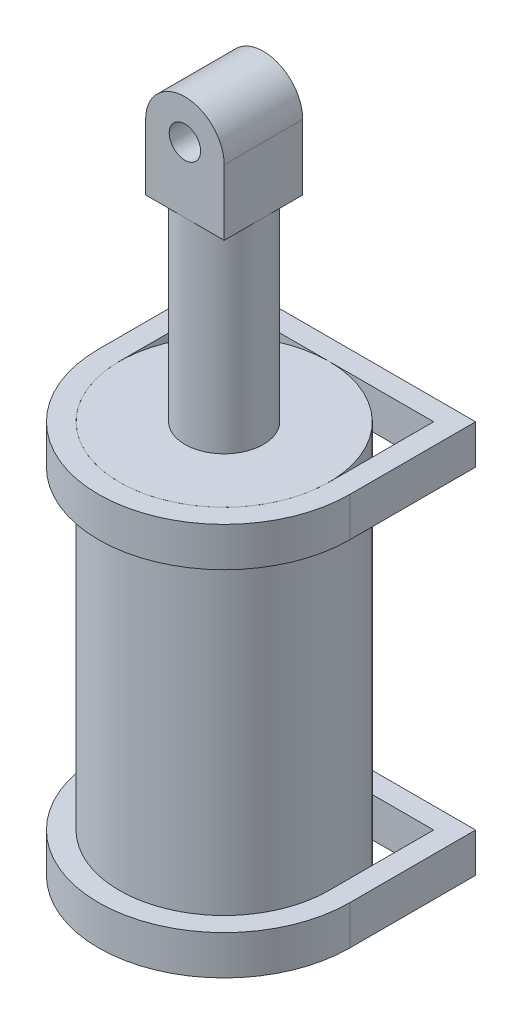
ISO-10303-21;
HEADER;
FILE_DESCRIPTION(('STEP AP214'),'2;1');
FILE_NAME('part.step','',(''),(''),'','','');
FILE_SCHEMA(('AUTOMOTIVE_DESIGN { 1 0 10303 214 1 1 1 1 }'));
ENDSEC;
DATA;
#1=APPLICATION_CONTEXT('core data for automotive mechanical design processes');
#2=APPLICATION_PROTOCOL_DEFINITION('international standard','automotive_design',2000,#1);
#3=PRODUCT_CONTEXT('',#1,'mechanical');
#4=PRODUCT('Part','Part','',(#3));
#5=PRODUCT_RELATED_PRODUCT_CATEGORY('part','',(#4));
#6=PRODUCT_DEFINITION_FORMATION('','',#4);
#7=PRODUCT_DEFINITION_CONTEXT('part definition',#1,'design');
#8=PRODUCT_DEFINITION('design','',#6,#7);
#9=PRODUCT_DEFINITION_SHAPE('','',#8);
#10=(LENGTH_UNIT() NAMED_UNIT(*) SI_UNIT(.MILLI.,.METRE.));
#11=(NAMED_UNIT(*) PLANE_ANGLE_UNIT() SI_UNIT($,.RADIAN.));
#12=(NAMED_UNIT(*) SI_UNIT($,.STERADIAN.) SOLID_ANGLE_UNIT());
#13=UNCERTAINTY_MEASURE_WITH_UNIT(LENGTH_MEASURE(1.E-05),#10,'distance_accuracy_value','');
#14=(GEOMETRIC_REPRESENTATION_CONTEXT(3) GLOBAL_UNCERTAINTY_ASSIGNED_CONTEXT((#13)) GLOBAL_UNIT_ASSIGNED_CONTEXT((#10,
#11,#12)) REPRESENTATION_CONTEXT('',''));
#15=CARTESIAN_POINT('',(0.,0.,0.));
#16=DIRECTION('',(0.,0.,1.));
#17=DIRECTION('',(1.,0.,0.));
#18=AXIS2_PLACEMENT_3D('',#15,#16,#17);
#19=CARTESIAN_POINT('',(0.,60.,0.));
#20=DIRECTION('',(0.,1.,0.));
#21=DIRECTION('',(0.,0.,1.));
#22=AXIS2_PLACEMENT_3D('',#19,#20,#21);
#23=CYLINDRICAL_SURFACE('',#22,48.);
#24=CARTESIAN_POINT('',(0.,75.,0.));
#25=DIRECTION('',(0.,1.,0.));
#26=DIRECTION('',(0.,0.,1.));
#27=AXIS2_PLACEMENT_3D('',#24,#25,#26);
#28=CIRCLE('',#27,48.);
#29=CARTESIAN_POINT('',(-48.,75.,0.));
#30=VERTEX_POINT('',#29);
#31=CARTESIAN_POINT('',(48.,75.,0.));
#32=VERTEX_POINT('',#31);
#33=EDGE_CURVE('E136',#30,#32,#28,.T.);
#34=ORIENTED_EDGE('',*,*,#33,.F.);
#35=DIRECTION('',(0.,1.,0.));
#36=VECTOR('',#35,1.);
#37=CARTESIAN_POINT('',(-48.,60.,0.));
#38=LINE('',#37,#36);
#39=CARTESIAN_POINT('',(-48.,60.,0.));
#40=VERTEX_POINT('',#39);
#41=EDGE_CURVE('E12',#40,#30,#38,.T.);
#42=ORIENTED_EDGE('',*,*,#41,.F.);
#43=CARTESIAN_POINT('',(0.,60.,0.));
#44=DIRECTION('',(0.,1.,0.));
#45=DIRECTION('',(0.,0.,1.));
#46=AXIS2_PLACEMENT_3D('',#43,#44,#45);
#47=CIRCLE('',#46,48.);
#48=CARTESIAN_POINT('',(48.,60.,0.));
#49=VERTEX_POINT('',#48);
#50=EDGE_CURVE('E122',#40,#49,#47,.T.);
#51=ORIENTED_EDGE('',*,*,#50,.T.);
#52=DIRECTION('',(0.,1.,0.));
#53=VECTOR('',#52,1.);
#54=CARTESIAN_POINT('',(48.,60.,0.));
#55=LINE('',#54,#53);
#56=EDGE_CURVE('E53',#49,#32,#55,.T.);
#57=ORIENTED_EDGE('',*,*,#56,.T.);
#58=EDGE_LOOP('',(#34,#42,#51,#57));
#59=FACE_BOUND('',#58,.T.);
#60=ADVANCED_FACE('F50',(#59),#23,.T.);
#61=CARTESIAN_POINT('',(-48.,60.,-58.));
#62=DIRECTION('',(-1.,0.,0.));
#63=DIRECTION('',(0.,0.,1.));
#64=AXIS2_PLACEMENT_3D('',#61,#62,#63);
#65=PLANE('',#64);
#66=DIRECTION('',(0.,1.,0.));
#67=VECTOR('',#66,1.);
#68=CARTESIAN_POINT('',(-48.,60.,-48.));
#69=LINE('',#68,#67);
#70=CARTESIAN_POINT('',(-48.,60.,-48.));
#71=VERTEX_POINT('',#70);
#72=CARTESIAN_POINT('',(-48.,75.,-48.));
#73=VERTEX_POINT('',#72);
#74=EDGE_CURVE('E127',#71,#73,#69,.T.);
#75=ORIENTED_EDGE('',*,*,#74,.F.);
#76=DIRECTION('',(0.,0.,1.));
#77=VECTOR('',#76,1.);
#78=CARTESIAN_POINT('',(-48.,60.,-58.));
#79=LINE('',#78,#77);
#80=EDGE_CURVE('E131',#71,#40,#79,.T.);
#81=ORIENTED_EDGE('',*,*,#80,.T.);
#82=ORIENTED_EDGE('',*,*,#41,.T.);
#83=DIRECTION('',(0.,0.,1.));
#84=VECTOR('',#83,1.);
#85=CARTESIAN_POINT('',(-48.,75.,-58.));
#86=LINE('',#85,#84);
#87=EDGE_CURVE('E141',#73,#30,#86,.T.);
#88=ORIENTED_EDGE('',*,*,#87,.F.);
#89=EDGE_LOOP('',(#75,#81,#82,#88));
#90=FACE_BOUND('',#89,.T.);
#91=ADVANCED_FACE('F178',(#90),#65,.T.);
#92=CARTESIAN_POINT('',(58.,60.,-48.));
#93=DIRECTION('',(0.,0.,-1.));
#94=DIRECTION('',(-1.,0.,0.));
#95=AXIS2_PLACEMENT_3D('',#92,#93,#94);
#96=PLANE('',#95);
#97=DIRECTION('',(0.,1.,0.));
#98=VECTOR('',#97,1.);
#99=CARTESIAN_POINT('',(48.,60.,-48.));
#100=LINE('',#99,#98);
#101=CARTESIAN_POINT('',(48.,60.,-48.));
#102=VERTEX_POINT('',#101);
#103=CARTESIAN_POINT('',(48.,75.,-48.));
#104=VERTEX_POINT('',#103);
#105=EDGE_CURVE('E116',#102,#104,#100,.T.);
#106=ORIENTED_EDGE('',*,*,#105,.F.);
#107=DIRECTION('',(-1.,0.,0.));
#108=VECTOR('',#107,1.);
#109=CARTESIAN_POINT('',(58.,60.,-48.));
#110=LINE('',#109,#108);
#111=EDGE_CURVE('E121',#102,#71,#110,.T.);
#112=ORIENTED_EDGE('',*,*,#111,.T.);
#113=ORIENTED_EDGE('',*,*,#74,.T.);
#114=DIRECTION('',(-1.,0.,0.));
#115=VECTOR('',#114,1.);
#116=CARTESIAN_POINT('',(58.,75.,-48.));
#117=LINE('',#116,#115);
#118=EDGE_CURVE('E69',#104,#73,#117,.T.);
#119=ORIENTED_EDGE('',*,*,#118,.F.);
#120=EDGE_LOOP('',(#106,#112,#113,#119));
#121=FACE_BOUND('',#120,.T.);
#122=ADVANCED_FACE('F125',(#121),#96,.T.);
#123=CARTESIAN_POINT('',(48.,60.,0.));
#124=DIRECTION('',(1.,0.,0.));
#125=DIRECTION('',(0.,0.,-1.));
#126=AXIS2_PLACEMENT_3D('',#123,#124,#125);
#127=PLANE('',#126);
#128=DIRECTION('',(0.,0.,-1.));
#129=VECTOR('',#128,1.);
#130=CARTESIAN_POINT('',(48.,75.,0.));
#131=LINE('',#130,#129);
#132=EDGE_CURVE('E64',#32,#104,#131,.T.);
#133=ORIENTED_EDGE('',*,*,#132,.F.);
#134=ORIENTED_EDGE('',*,*,#56,.F.);
#135=DIRECTION('',(0.,0.,-1.));
#136=VECTOR('',#135,1.);
#137=CARTESIAN_POINT('',(48.,60.,0.));
#138=LINE('',#137,#136);
#139=EDGE_CURVE('E113',#49,#102,#138,.T.);
#140=ORIENTED_EDGE('',*,*,#139,.T.);
#141=ORIENTED_EDGE('',*,*,#105,.T.);
#142=EDGE_LOOP('',(#133,#134,#140,#141));
#143=FACE_BOUND('',#142,.T.);
#144=ADVANCED_FACE('F115',(#143),#127,.T.);
#145=CARTESIAN_POINT('',(0.,60.,0.));
#146=DIRECTION('',(0.,1.,0.));
#147=DIRECTION('',(0.,0.,1.));
#148=AXIS2_PLACEMENT_3D('',#145,#146,#147);
#149=PLANE('',#148);
#150=DIRECTION('',(0.,0.,-1.));
#151=VECTOR('',#150,1.);
#152=CARTESIAN_POINT('',(40.,60.,-40.));
#153=LINE('',#152,#151);
#154=CARTESIAN_POINT('',(40.,60.,0.));
#155=VERTEX_POINT('',#154);
#156=CARTESIAN_POINT('',(40.,60.,-40.));
#157=VERTEX_POINT('',#156);
#158=EDGE_CURVE('E150',#155,#157,#153,.T.);
#159=ORIENTED_EDGE('',*,*,#158,.T.);
#160=DIRECTION('',(-1.,0.,0.));
#161=VECTOR('',#160,1.);
#162=CARTESIAN_POINT('',(-40.,60.,-40.));
#163=LINE('',#162,#161);
#164=CARTESIAN_POINT('',(-40.,60.,-40.));
#165=VERTEX_POINT('',#164);
#166=EDGE_CURVE('E158',#157,#165,#163,.T.);
#167=ORIENTED_EDGE('',*,*,#166,.T.);
#168=DIRECTION('',(0.,0.,1.));
#169=VECTOR('',#168,1.);
#170=CARTESIAN_POINT('',(-40.,60.,0.));
#171=LINE('',#170,#169);
#172=CARTESIAN_POINT('',(-40.,60.,0.));
#173=VERTEX_POINT('',#172);
#174=EDGE_CURVE('E172',#165,#173,#171,.T.);
#175=ORIENTED_EDGE('',*,*,#174,.T.);
#176=CARTESIAN_POINT('',(0.,60.,0.));
#177=DIRECTION('',(0.,1.,0.));
#178=DIRECTION('',(0.,0.,1.));
#179=AXIS2_PLACEMENT_3D('',#176,#177,#178);
#180=CIRCLE('',#179,40.);
#181=EDGE_CURVE('E169',#173,#155,#180,.T.);
#182=ORIENTED_EDGE('',*,*,#181,.T.);
#183=EDGE_LOOP('',(#159,#167,#175,#182));
#184=FACE_BOUND('',#183,.T.);
#185=ORIENTED_EDGE('',*,*,#111,.F.);
#186=ORIENTED_EDGE('',*,*,#139,.F.);
#187=ORIENTED_EDGE('',*,*,#50,.F.);
#188=ORIENTED_EDGE('',*,*,#80,.F.);
#189=EDGE_LOOP('',(#185,#186,#187,#188));
#190=FACE_BOUND('',#189,.T.);
#191=ADVANCED_FACE('F130',(#184,#190),#149,.F.);
#192=CARTESIAN_POINT('',(0.,75.,0.));
#193=DIRECTION('',(0.,1.,0.));
#194=DIRECTION('',(0.,0.,1.));
#195=AXIS2_PLACEMENT_3D('',#192,#193,#194);
#196=PLANE('',#195);
#197=ORIENTED_EDGE('',*,*,#132,.T.);
#198=ORIENTED_EDGE('',*,*,#118,.T.);
#199=ORIENTED_EDGE('',*,*,#87,.T.);
#200=ORIENTED_EDGE('',*,*,#33,.T.);
#201=EDGE_LOOP('',(#197,#198,#199,#200));
#202=FACE_BOUND('',#201,.T.);
#203=DIRECTION('',(-1.,0.,0.));
#204=VECTOR('',#203,1.);
#205=CARTESIAN_POINT('',(-40.,75.,-40.));
#206=LINE('',#205,#204);
#207=CARTESIAN_POINT('',(40.,75.,-40.));
#208=VERTEX_POINT('',#207);
#209=CARTESIAN_POINT('',(-40.,75.,-40.));
#210=VERTEX_POINT('',#209);
#211=EDGE_CURVE('E165',#208,#210,#206,.T.);
#212=ORIENTED_EDGE('',*,*,#211,.F.);
#213=DIRECTION('',(0.,0.,-1.));
#214=VECTOR('',#213,1.);
#215=CARTESIAN_POINT('',(40.,75.,-40.));
#216=LINE('',#215,#214);
#217=CARTESIAN_POINT('',(40.,75.,0.));
#218=VERTEX_POINT('',#217);
#219=EDGE_CURVE('E155',#218,#208,#216,.T.);
#220=ORIENTED_EDGE('',*,*,#219,.F.);
#221=CARTESIAN_POINT('',(0.,75.,0.));
#222=DIRECTION('',(0.,1.,0.));
#223=DIRECTION('',(0.,0.,1.));
#224=AXIS2_PLACEMENT_3D('',#221,#222,#223);
#225=CIRCLE('',#224,40.);
#226=CARTESIAN_POINT('',(-40.,75.,0.));
#227=VERTEX_POINT('',#226);
#228=EDGE_CURVE('E159',#227,#218,#225,.T.);
#229=ORIENTED_EDGE('',*,*,#228,.F.);
#230=DIRECTION('',(0.,0.,1.));
#231=VECTOR('',#230,1.);
#232=CARTESIAN_POINT('',(-40.,75.,0.));
#233=LINE('',#232,#231);
#234=EDGE_CURVE('E162',#210,#227,#233,.T.);
#235=ORIENTED_EDGE('',*,*,#234,.F.);
#236=EDGE_LOOP('',(#212,#220,#229,#235));
#237=FACE_BOUND('',#236,.T.);
#238=ADVANCED_FACE('F180',(#202,#237),#196,.T.);
#239=CARTESIAN_POINT('',(-40.,60.,-40.));
#240=DIRECTION('',(0.,0.,-1.));
#241=DIRECTION('',(-1.,0.,0.));
#242=AXIS2_PLACEMENT_3D('',#239,#240,#241);
#243=PLANE('',#242);
#244=ORIENTED_EDGE('',*,*,#211,.T.);
#245=DIRECTION('',(0.,1.,0.));
#246=VECTOR('',#245,1.);
#247=CARTESIAN_POINT('',(-40.,60.,-40.));
#248=LINE('',#247,#246);
#249=EDGE_CURVE('E146',#165,#210,#248,.T.);
#250=ORIENTED_EDGE('',*,*,#249,.F.);
#251=ORIENTED_EDGE('',*,*,#166,.F.);
#252=DIRECTION('',(0.,1.,0.));
#253=VECTOR('',#252,1.);
#254=CARTESIAN_POINT('',(40.,60.,-40.));
#255=LINE('',#254,#253);
#256=EDGE_CURVE('E138',#157,#208,#255,.T.);
#257=ORIENTED_EDGE('',*,*,#256,.T.);
#258=EDGE_LOOP('',(#244,#250,#251,#257));
#259=FACE_BOUND('',#258,.T.);
#260=ADVANCED_FACE('F183',(#259),#243,.F.);
#261=CARTESIAN_POINT('',(40.,60.,-40.));
#262=DIRECTION('',(1.,0.,0.));
#263=DIRECTION('',(0.,0.,-1.));
#264=AXIS2_PLACEMENT_3D('',#261,#262,#263);
#265=PLANE('',#264);
#266=ORIENTED_EDGE('',*,*,#219,.T.);
#267=ORIENTED_EDGE('',*,*,#256,.F.);
#268=ORIENTED_EDGE('',*,*,#158,.F.);
#269=DIRECTION('',(0.,1.,0.));
#270=VECTOR('',#269,1.);
#271=CARTESIAN_POINT('',(40.,60.,0.));
#272=LINE('',#271,#270);
#273=EDGE_CURVE('E152',#155,#218,#272,.T.);
#274=ORIENTED_EDGE('',*,*,#273,.T.);
#275=EDGE_LOOP('',(#266,#267,#268,#274));
#276=FACE_BOUND('',#275,.T.);
#277=ADVANCED_FACE('F198',(#276),#265,.F.);
#278=CARTESIAN_POINT('',(0.,60.,0.));
#279=DIRECTION('',(0.,1.,0.));
#280=DIRECTION('',(0.,0.,1.));
#281=AXIS2_PLACEMENT_3D('',#278,#279,#280);
#282=CYLINDRICAL_SURFACE('',#281,40.);
#283=ORIENTED_EDGE('',*,*,#228,.T.);
#284=ORIENTED_EDGE('',*,*,#273,.F.);
#285=ORIENTED_EDGE('',*,*,#181,.F.);
#286=DIRECTION('',(0.,1.,0.));
#287=VECTOR('',#286,1.);
#288=CARTESIAN_POINT('',(-40.,60.,0.));
#289=LINE('',#288,#287);
#290=EDGE_CURVE('E149',#173,#227,#289,.T.);
#291=ORIENTED_EDGE('',*,*,#290,.T.);
#292=EDGE_LOOP('',(#283,#284,#285,#291));
#293=FACE_BOUND('',#292,.T.);
#294=ADVANCED_FACE('F200',(#293),#282,.F.);
#295=CARTESIAN_POINT('',(-40.,60.,0.));
#296=DIRECTION('',(-1.,0.,0.));
#297=DIRECTION('',(0.,0.,1.));
#298=AXIS2_PLACEMENT_3D('',#295,#296,#297);
#299=PLANE('',#298);
#300=ORIENTED_EDGE('',*,*,#234,.T.);
#301=ORIENTED_EDGE('',*,*,#290,.F.);
#302=ORIENTED_EDGE('',*,*,#174,.F.);
#303=ORIENTED_EDGE('',*,*,#249,.T.);
#304=EDGE_LOOP('',(#300,#301,#302,#303));
#305=FACE_BOUND('',#304,.T.);
#306=ADVANCED_FACE('F193',(#305),#299,.F.);
#307=CLOSED_SHELL('',(#60,#91,#122,#144,#191,#238,#260,#277,#294,#306));
#308=MANIFOLD_SOLID_BREP('B2',#307);
#309=CARTESIAN_POINT('',(0.,-60.,0.));
#310=DIRECTION('',(0.,-1.,0.));
#311=DIRECTION('',(0.,0.,-1.));
#312=AXIS2_PLACEMENT_3D('',#309,#310,#311);
#313=CYLINDRICAL_SURFACE('',#312,48.);
#314=CARTESIAN_POINT('',(0.,-75.,0.));
#315=DIRECTION('',(0.,-1.,0.));
#316=DIRECTION('',(0.,0.,-1.));
#317=AXIS2_PLACEMENT_3D('',#314,#315,#316);
#318=CIRCLE('',#317,48.);
#319=CARTESIAN_POINT('',(48.,-75.,0.));
#320=VERTEX_POINT('',#319);
#321=CARTESIAN_POINT('',(-48.,-75.,0.));
#322=VERTEX_POINT('',#321);
#323=EDGE_CURVE('E386',#320,#322,#318,.T.);
#324=ORIENTED_EDGE('',*,*,#323,.F.);
#325=DIRECTION('',(0.,-1.,0.));
#326=VECTOR('',#325,1.);
#327=CARTESIAN_POINT('',(48.,-60.,0.));
#328=LINE('',#327,#326);
#329=CARTESIAN_POINT('',(48.,-60.,0.));
#330=VERTEX_POINT('',#329);
#331=EDGE_CURVE('E48',#330,#320,#328,.T.);
#332=ORIENTED_EDGE('',*,*,#331,.F.);
#333=CARTESIAN_POINT('',(0.,-60.,0.));
#334=DIRECTION('',(0.,-1.,0.));
#335=DIRECTION('',(0.,0.,-1.));
#336=AXIS2_PLACEMENT_3D('',#333,#334,#335);
#337=CIRCLE('',#336,48.);
#338=CARTESIAN_POINT('',(-48.,-60.,0.));
#339=VERTEX_POINT('',#338);
#340=EDGE_CURVE('E366',#330,#339,#337,.T.);
#341=ORIENTED_EDGE('',*,*,#340,.T.);
#342=DIRECTION('',(0.,-1.,0.));
#343=VECTOR('',#342,1.);
#344=CARTESIAN_POINT('',(-48.,-60.,0.));
#345=LINE('',#344,#343);
#346=EDGE_CURVE('E298',#339,#322,#345,.T.);
#347=ORIENTED_EDGE('',*,*,#346,.T.);
#348=EDGE_LOOP('',(#324,#332,#341,#347));
#349=FACE_BOUND('',#348,.T.);
#350=ADVANCED_FACE('F295',(#349),#313,.T.);
#351=CARTESIAN_POINT('',(48.,-60.,-40.));
#352=DIRECTION('',(1.,0.,0.));
#353=DIRECTION('',(0.,0.,-1.));
#354=AXIS2_PLACEMENT_3D('',#351,#352,#353);
#355=PLANE('',#354);
#356=DIRECTION('',(0.,0.,1.));
#357=VECTOR('',#356,1.);
#358=CARTESIAN_POINT('',(48.,-75.,-40.));
#359=LINE('',#358,#357);
#360=CARTESIAN_POINT('',(48.,-75.,-48.));
#361=VERTEX_POINT('',#360);
#362=EDGE_CURVE('E373',#361,#320,#359,.T.);
#363=ORIENTED_EDGE('',*,*,#362,.F.);
#364=DIRECTION('',(0.,1.,0.));
#365=VECTOR('',#364,1.);
#366=CARTESIAN_POINT('',(48.,-60.,-48.));
#367=LINE('',#366,#365);
#368=CARTESIAN_POINT('',(48.,-60.,-48.));
#369=VERTEX_POINT('',#368);
#370=EDGE_CURVE('E370',#361,#369,#367,.T.);
#371=ORIENTED_EDGE('',*,*,#370,.T.);
#372=DIRECTION('',(0.,0.,1.));
#373=VECTOR('',#372,1.);
#374=CARTESIAN_POINT('',(48.,-60.,-40.));
#375=LINE('',#374,#373);
#376=EDGE_CURVE('E358',#369,#330,#375,.T.);
#377=ORIENTED_EDGE('',*,*,#376,.T.);
#378=ORIENTED_EDGE('',*,*,#331,.T.);
#379=EDGE_LOOP('',(#363,#371,#377,#378));
#380=FACE_BOUND('',#379,.T.);
#381=ADVANCED_FACE('F371',(#380),#355,.T.);
#382=CARTESIAN_POINT('',(40.,-60.,-48.));
#383=DIRECTION('',(0.,0.,-1.));
#384=DIRECTION('',(-1.,0.,0.));
#385=AXIS2_PLACEMENT_3D('',#382,#383,#384);
#386=PLANE('',#385);
#387=ORIENTED_EDGE('',*,*,#370,.F.);
#388=DIRECTION('',(1.,0.,0.));
#389=VECTOR('',#388,1.);
#390=CARTESIAN_POINT('',(40.,-75.,-48.));
#391=LINE('',#390,#389);
#392=CARTESIAN_POINT('',(-48.,-75.,-48.));
#393=VERTEX_POINT('',#392);
#394=EDGE_CURVE('E393',#393,#361,#391,.T.);
#395=ORIENTED_EDGE('',*,*,#394,.F.);
#396=DIRECTION('',(0.,1.,0.));
#397=VECTOR('',#396,1.);
#398=CARTESIAN_POINT('',(-48.,-60.,-48.));
#399=LINE('',#398,#397);
#400=CARTESIAN_POINT('',(-48.,-60.,-48.));
#401=VERTEX_POINT('',#400);
#402=EDGE_CURVE('E376',#393,#401,#399,.T.);
#403=ORIENTED_EDGE('',*,*,#402,.T.);
#404=DIRECTION('',(1.,0.,0.));
#405=VECTOR('',#404,1.);
#406=CARTESIAN_POINT('',(-40.,-60.,-48.));
#407=LINE('',#406,#405);
#408=EDGE_CURVE('E363',#401,#369,#407,.T.);
#409=ORIENTED_EDGE('',*,*,#408,.T.);
#410=EDGE_LOOP('',(#387,#395,#403,#409));
#411=FACE_BOUND('',#410,.T.);
#412=ADVANCED_FACE('F378',(#411),#386,.T.);
#413=CARTESIAN_POINT('',(-48.,-60.,-40.));
#414=DIRECTION('',(-1.,0.,0.));
#415=DIRECTION('',(0.,0.,1.));
#416=AXIS2_PLACEMENT_3D('',#413,#414,#415);
#417=PLANE('',#416);
#418=ORIENTED_EDGE('',*,*,#402,.F.);
#419=DIRECTION('',(0.,0.,-1.));
#420=VECTOR('',#419,1.);
#421=CARTESIAN_POINT('',(-48.,-75.,-40.));
#422=LINE('',#421,#420);
#423=EDGE_CURVE('E389',#322,#393,#422,.T.);
#424=ORIENTED_EDGE('',*,*,#423,.F.);
#425=ORIENTED_EDGE('',*,*,#346,.F.);
#426=DIRECTION('',(0.,0.,-1.));
#427=VECTOR('',#426,1.);
#428=CARTESIAN_POINT('',(-48.,-60.,0.));
#429=LINE('',#428,#427);
#430=EDGE_CURVE('E381',#339,#401,#429,.T.);
#431=ORIENTED_EDGE('',*,*,#430,.T.);
#432=EDGE_LOOP('',(#418,#424,#425,#431));
#433=FACE_BOUND('',#432,.T.);
#434=ADVANCED_FACE('F457',(#433),#417,.T.);
#435=CARTESIAN_POINT('',(0.,-60.,0.));
#436=DIRECTION('',(0.,-1.,0.));
#437=DIRECTION('',(0.,0.,-1.));
#438=AXIS2_PLACEMENT_3D('',#435,#436,#437);
#439=PLANE('',#438);
#440=DIRECTION('',(0.,0.,1.));
#441=VECTOR('',#440,1.);
#442=CARTESIAN_POINT('',(40.,-60.,-40.));
#443=LINE('',#442,#441);
#444=CARTESIAN_POINT('',(40.,-60.,-40.));
#445=VERTEX_POINT('',#444);
#446=CARTESIAN_POINT('',(40.,-60.,0.));
#447=VERTEX_POINT('',#446);
#448=EDGE_CURVE('E402',#445,#447,#443,.T.);
#449=ORIENTED_EDGE('',*,*,#448,.T.);
#450=CARTESIAN_POINT('',(0.,-60.,0.));
#451=DIRECTION('',(0.,-1.,0.));
#452=DIRECTION('',(0.,0.,-1.));
#453=AXIS2_PLACEMENT_3D('',#450,#451,#452);
#454=CIRCLE('',#453,40.);
#455=CARTESIAN_POINT('',(-40.,-60.,0.));
#456=VERTEX_POINT('',#455);
#457=EDGE_CURVE('E410',#447,#456,#454,.T.);
#458=ORIENTED_EDGE('',*,*,#457,.T.);
#459=DIRECTION('',(0.,0.,-1.));
#460=VECTOR('',#459,1.);
#461=CARTESIAN_POINT('',(-40.,-60.,0.));
#462=LINE('',#461,#460);
#463=CARTESIAN_POINT('',(-40.,-60.,-40.));
#464=VERTEX_POINT('',#463);
#465=EDGE_CURVE('E421',#456,#464,#462,.T.);
#466=ORIENTED_EDGE('',*,*,#465,.T.);
#467=DIRECTION('',(1.,0.,0.));
#468=VECTOR('',#467,1.);
#469=CARTESIAN_POINT('',(-40.,-60.,-40.));
#470=LINE('',#469,#468);
#471=EDGE_CURVE('E309',#464,#445,#470,.T.);
#472=ORIENTED_EDGE('',*,*,#471,.T.);
#473=EDGE_LOOP('',(#449,#458,#466,#472));
#474=FACE_BOUND('',#473,.T.);
#475=ORIENTED_EDGE('',*,*,#376,.F.);
#476=ORIENTED_EDGE('',*,*,#408,.F.);
#477=ORIENTED_EDGE('',*,*,#430,.F.);
#478=ORIENTED_EDGE('',*,*,#340,.F.);
#479=EDGE_LOOP('',(#475,#476,#477,#478));
#480=FACE_BOUND('',#479,.T.);
#481=ADVANCED_FACE('F360',(#474,#480),#439,.F.);
#482=CARTESIAN_POINT('',(0.,-75.,0.));
#483=DIRECTION('',(0.,-1.,0.));
#484=DIRECTION('',(0.,0.,-1.));
#485=AXIS2_PLACEMENT_3D('',#482,#483,#484);
#486=PLANE('',#485);
#487=ORIENTED_EDGE('',*,*,#394,.T.);
#488=ORIENTED_EDGE('',*,*,#362,.T.);
#489=ORIENTED_EDGE('',*,*,#323,.T.);
#490=ORIENTED_EDGE('',*,*,#423,.T.);
#491=EDGE_LOOP('',(#487,#488,#489,#490));
#492=FACE_BOUND('',#491,.T.);
#493=CARTESIAN_POINT('',(0.,-75.,0.));
#494=DIRECTION('',(0.,-1.,0.));
#495=DIRECTION('',(0.,0.,-1.));
#496=AXIS2_PLACEMENT_3D('',#493,#494,#495);
#497=CIRCLE('',#496,40.);
#498=CARTESIAN_POINT('',(40.,-75.,0.));
#499=VERTEX_POINT('',#498);
#500=CARTESIAN_POINT('',(-40.,-75.,0.));
#501=VERTEX_POINT('',#500);
#502=EDGE_CURVE('E317',#499,#501,#497,.T.);
#503=ORIENTED_EDGE('',*,*,#502,.F.);
#504=DIRECTION('',(0.,0.,1.));
#505=VECTOR('',#504,1.);
#506=CARTESIAN_POINT('',(40.,-75.,-40.));
#507=LINE('',#506,#505);
#508=CARTESIAN_POINT('',(40.,-75.,-40.));
#509=VERTEX_POINT('',#508);
#510=EDGE_CURVE('E407',#509,#499,#507,.T.);
#511=ORIENTED_EDGE('',*,*,#510,.F.);
#512=DIRECTION('',(1.,0.,0.));
#513=VECTOR('',#512,1.);
#514=CARTESIAN_POINT('',(-40.,-75.,-40.));
#515=LINE('',#514,#513);
#516=CARTESIAN_POINT('',(-40.,-75.,-40.));
#517=VERTEX_POINT('',#516);
#518=EDGE_CURVE('E411',#517,#509,#515,.T.);
#519=ORIENTED_EDGE('',*,*,#518,.F.);
#520=DIRECTION('',(0.,0.,-1.));
#521=VECTOR('',#520,1.);
#522=CARTESIAN_POINT('',(-40.,-75.,0.));
#523=LINE('',#522,#521);
#524=EDGE_CURVE('E414',#501,#517,#523,.T.);
#525=ORIENTED_EDGE('',*,*,#524,.F.);
#526=EDGE_LOOP('',(#503,#511,#519,#525));
#527=FACE_BOUND('',#526,.T.);
#528=ADVANCED_FACE('F438',(#492,#527),#486,.T.);
#529=CARTESIAN_POINT('',(0.,-60.,0.));
#530=DIRECTION('',(0.,-1.,0.));
#531=DIRECTION('',(0.,0.,-1.));
#532=AXIS2_PLACEMENT_3D('',#529,#530,#531);
#533=CYLINDRICAL_SURFACE('',#532,40.);
#534=ORIENTED_EDGE('',*,*,#502,.T.);
#535=DIRECTION('',(0.,-1.,0.));
#536=VECTOR('',#535,1.);
#537=CARTESIAN_POINT('',(-40.,-60.,0.));
#538=LINE('',#537,#536);
#539=EDGE_CURVE('E399',#456,#501,#538,.T.);
#540=ORIENTED_EDGE('',*,*,#539,.F.);
#541=ORIENTED_EDGE('',*,*,#457,.F.);
#542=DIRECTION('',(0.,-1.,0.));
#543=VECTOR('',#542,1.);
#544=CARTESIAN_POINT('',(40.,-60.,0.));
#545=LINE('',#544,#543);
#546=EDGE_CURVE('E390',#447,#499,#545,.T.);
#547=ORIENTED_EDGE('',*,*,#546,.T.);
#548=EDGE_LOOP('',(#534,#540,#541,#547));
#549=FACE_BOUND('',#548,.T.);
#550=ADVANCED_FACE('F430',(#549),#533,.F.);
#551=CARTESIAN_POINT('',(40.,-60.,-40.));
#552=DIRECTION('',(1.,0.,0.));
#553=DIRECTION('',(0.,0.,-1.));
#554=AXIS2_PLACEMENT_3D('',#551,#552,#553);
#555=PLANE('',#554);
#556=ORIENTED_EDGE('',*,*,#510,.T.);
#557=ORIENTED_EDGE('',*,*,#546,.F.);
#558=ORIENTED_EDGE('',*,*,#448,.F.);
#559=DIRECTION('',(0.,-1.,0.));
#560=VECTOR('',#559,1.);
#561=CARTESIAN_POINT('',(40.,-60.,-40.));
#562=LINE('',#561,#560);
#563=EDGE_CURVE('E404',#445,#509,#562,.T.);
#564=ORIENTED_EDGE('',*,*,#563,.T.);
#565=EDGE_LOOP('',(#556,#557,#558,#564));
#566=FACE_BOUND('',#565,.T.);
#567=ADVANCED_FACE('F440',(#566),#555,.F.);
#568=CARTESIAN_POINT('',(-40.,-60.,-40.));
#569=DIRECTION('',(0.,0.,-1.));
#570=DIRECTION('',(-1.,0.,0.));
#571=AXIS2_PLACEMENT_3D('',#568,#569,#570);
#572=PLANE('',#571);
#573=ORIENTED_EDGE('',*,*,#518,.T.);
#574=ORIENTED_EDGE('',*,*,#563,.F.);
#575=ORIENTED_EDGE('',*,*,#471,.F.);
#576=DIRECTION('',(0.,-1.,0.));
#577=VECTOR('',#576,1.);
#578=CARTESIAN_POINT('',(-40.,-60.,-40.));
#579=LINE('',#578,#577);
#580=EDGE_CURVE('E401',#464,#517,#579,.T.);
#581=ORIENTED_EDGE('',*,*,#580,.T.);
#582=EDGE_LOOP('',(#573,#574,#575,#581));
#583=FACE_BOUND('',#582,.T.);
#584=ADVANCED_FACE('F435',(#583),#572,.F.);
#585=CARTESIAN_POINT('',(-40.,-60.,0.));
#586=DIRECTION('',(-1.,0.,0.));
#587=DIRECTION('',(0.,0.,1.));
#588=AXIS2_PLACEMENT_3D('',#585,#586,#587);
#589=PLANE('',#588);
#590=ORIENTED_EDGE('',*,*,#524,.T.);
#591=ORIENTED_EDGE('',*,*,#580,.F.);
#592=ORIENTED_EDGE('',*,*,#465,.F.);
#593=ORIENTED_EDGE('',*,*,#539,.T.);
#594=EDGE_LOOP('',(#590,#591,#592,#593));
#595=FACE_BOUND('',#594,.T.);
#596=ADVANCED_FACE('F433',(#595),#589,.F.);
#597=CLOSED_SHELL('',(#350,#381,#412,#434,#481,#528,#550,#567,#584,#596));
#598=MANIFOLD_SOLID_BREP('B6',#597);
#599=CARTESIAN_POINT('',(0.,75.,0.));
#600=DIRECTION('',(0.,-1.,0.));
#601=DIRECTION('',(0.,0.,-1.));
#602=AXIS2_PLACEMENT_3D('',#599,#600,#601);
#603=CYLINDRICAL_SURFACE('',#602,40.);
#604=CARTESIAN_POINT('',(0.,75.,0.));
#605=DIRECTION('',(0.,1.,0.));
#606=DIRECTION('',(0.,0.,1.));
#607=AXIS2_PLACEMENT_3D('',#604,#605,#606);
#608=CIRCLE('',#607,40.);
#609=CARTESIAN_POINT('',(0.,75.,40.));
#610=VERTEX_POINT('',#609);
#611=EDGE_CURVE('E549',#610,#610,#608,.T.);
#612=ORIENTED_EDGE('',*,*,#611,.F.);
#613=EDGE_LOOP('',(#612));
#614=FACE_BOUND('',#613,.T.);
#615=CARTESIAN_POINT('',(0.,-75.,0.));
#616=DIRECTION('',(0.,1.,0.));
#617=DIRECTION('',(0.,0.,1.));
#618=AXIS2_PLACEMENT_3D('',#615,#616,#617);
#619=CIRCLE('',#618,40.);
#620=CARTESIAN_POINT('',(0.,-75.,40.));
#621=VERTEX_POINT('',#620);
#622=EDGE_CURVE('E662',#621,#621,#619,.T.);
#623=ORIENTED_EDGE('',*,*,#622,.T.);
#624=EDGE_LOOP('',(#623));
#625=FACE_BOUND('',#624,.T.);
#626=ADVANCED_FACE('F540',(#614,#625),#603,.T.);
#627=CARTESIAN_POINT('',(0.,75.,0.));
#628=DIRECTION('',(0.,1.,0.));
#629=DIRECTION('',(0.,0.,1.));
#630=AXIS2_PLACEMENT_3D('',#627,#628,#629);
#631=PLANE('',#630);
#632=CARTESIAN_POINT('',(0.,75.,0.));
#633=DIRECTION('',(0.,1.,0.));
#634=DIRECTION('',(0.,0.,1.));
#635=AXIS2_PLACEMENT_3D('',#632,#633,#634);
#636=CIRCLE('',#635,15.);
#637=CARTESIAN_POINT('',(0.,75.,15.));
#638=VERTEX_POINT('',#637);
#639=EDGE_CURVE('E293',#638,#638,#636,.T.);
#640=ORIENTED_EDGE('',*,*,#639,.F.);
#641=EDGE_LOOP('',(#640));
#642=FACE_BOUND('',#641,.T.);
#643=ORIENTED_EDGE('',*,*,#611,.T.);
#644=EDGE_LOOP('',(#643));
#645=FACE_BOUND('',#644,.T.);
#646=ADVANCED_FACE('F675',(#642,#645),#631,.T.);
#647=CARTESIAN_POINT('',(0.,-75.,0.));
#648=DIRECTION('',(0.,1.,0.));
#649=DIRECTION('',(0.,0.,1.));
#650=AXIS2_PLACEMENT_3D('',#647,#648,#649);
#651=PLANE('',#650);
#652=ORIENTED_EDGE('',*,*,#622,.F.);
#653=EDGE_LOOP('',(#652));
#654=FACE_BOUND('',#653,.T.);
#655=ADVANCED_FACE('F672',(#654),#651,.F.);
#656=CARTESIAN_POINT('',(0.,150.,0.));
#657=DIRECTION('',(0.,-1.,0.));
#658=DIRECTION('',(0.,0.,-1.));
#659=AXIS2_PLACEMENT_3D('',#656,#657,#658);
#660=CYLINDRICAL_SURFACE('',#659,15.);
#661=CARTESIAN_POINT('',(0.,150.,0.));
#662=DIRECTION('',(0.,1.,0.));
#663=DIRECTION('',(0.,0.,1.));
#664=AXIS2_PLACEMENT_3D('',#661,#662,#663);
#665=CIRCLE('',#664,15.);
#666=CARTESIAN_POINT('',(0.,150.,15.));
#667=VERTEX_POINT('',#666);
#668=CARTESIAN_POINT('',(15.,150.,0.));
#669=VERTEX_POINT('',#668);
#670=EDGE_CURVE('E659',#667,#669,#665,.T.);
#671=ORIENTED_EDGE('',*,*,#670,.F.);
#672=CARTESIAN_POINT('',(-15.,150.,0.));
#673=VERTEX_POINT('',#672);
#674=EDGE_CURVE('E557',#673,#667,#665,.T.);
#675=ORIENTED_EDGE('',*,*,#674,.F.);
#676=CARTESIAN_POINT('',(0.,150.,-15.));
#677=VERTEX_POINT('',#676);
#678=EDGE_CURVE('E561',#677,#673,#665,.T.);
#679=ORIENTED_EDGE('',*,*,#678,.F.);
#680=EDGE_CURVE('E663',#669,#677,#665,.T.);
#681=ORIENTED_EDGE('',*,*,#680,.F.);
#682=EDGE_LOOP('',(#671,#675,#679,#681));
#683=FACE_BOUND('',#682,.T.);
#684=ORIENTED_EDGE('',*,*,#639,.T.);
#685=EDGE_LOOP('',(#684));
#686=FACE_BOUND('',#685,.T.);
#687=ADVANCED_FACE('F674',(#683,#686),#660,.T.);
#688=CARTESIAN_POINT('',(0.,150.,0.));
#689=DIRECTION('',(0.,1.,0.));
#690=DIRECTION('',(0.,0.,1.));
#691=AXIS2_PLACEMENT_3D('',#688,#689,#690);
#692=PLANE('',#691);
#693=DIRECTION('',(1.,0.,0.));
#694=VECTOR('',#693,1.);
#695=CARTESIAN_POINT('',(-15.,150.,15.));
#696=LINE('',#695,#694);
#697=CARTESIAN_POINT('',(15.,150.,15.));
#698=VERTEX_POINT('',#697);
#699=EDGE_CURVE('E616',#667,#698,#696,.T.);
#700=ORIENTED_EDGE('',*,*,#699,.F.);
#701=ORIENTED_EDGE('',*,*,#670,.T.);
#702=DIRECTION('',(0.,0.,-1.));
#703=VECTOR('',#702,1.);
#704=CARTESIAN_POINT('',(15.,150.,-15.));
#705=LINE('',#704,#703);
#706=EDGE_CURVE('E636',#698,#669,#705,.T.);
#707=ORIENTED_EDGE('',*,*,#706,.F.);
#708=EDGE_LOOP('',(#700,#701,#707));
#709=FACE_BOUND('',#708,.T.);
#710=ADVANCED_FACE('F680',(#709),#692,.F.);
#711=CARTESIAN_POINT('',(15.,150.,-15.));
#712=VERTEX_POINT('',#711);
#713=EDGE_CURVE('E629',#669,#712,#705,.T.);
#714=ORIENTED_EDGE('',*,*,#713,.F.);
#715=ORIENTED_EDGE('',*,*,#680,.T.);
#716=DIRECTION('',(-1.,0.,0.));
#717=VECTOR('',#716,1.);
#718=CARTESIAN_POINT('',(-15.,150.,-15.));
#719=LINE('',#718,#717);
#720=EDGE_CURVE('E640',#712,#677,#719,.T.);
#721=ORIENTED_EDGE('',*,*,#720,.F.);
#722=EDGE_LOOP('',(#714,#715,#721));
#723=FACE_BOUND('',#722,.T.);
#724=ADVANCED_FACE('F711',(#723),#692,.F.);
#725=CARTESIAN_POINT('',(-15.,150.,-15.));
#726=VERTEX_POINT('',#725);
#727=EDGE_CURVE('E639',#677,#726,#719,.T.);
#728=ORIENTED_EDGE('',*,*,#727,.F.);
#729=ORIENTED_EDGE('',*,*,#678,.T.);
#730=DIRECTION('',(0.,0.,1.));
#731=VECTOR('',#730,1.);
#732=CARTESIAN_POINT('',(-15.,150.,-15.));
#733=LINE('',#732,#731);
#734=EDGE_CURVE('E645',#726,#673,#733,.T.);
#735=ORIENTED_EDGE('',*,*,#734,.F.);
#736=EDGE_LOOP('',(#728,#729,#735));
#737=FACE_BOUND('',#736,.T.);
#738=ADVANCED_FACE('F722',(#737),#692,.F.);
#739=CARTESIAN_POINT('',(-15.,150.,15.));
#740=VERTEX_POINT('',#739);
#741=EDGE_CURVE('E644',#673,#740,#733,.T.);
#742=ORIENTED_EDGE('',*,*,#741,.F.);
#743=ORIENTED_EDGE('',*,*,#674,.T.);
#744=EDGE_CURVE('E607',#740,#667,#696,.T.);
#745=ORIENTED_EDGE('',*,*,#744,.F.);
#746=EDGE_LOOP('',(#742,#743,#745));
#747=FACE_BOUND('',#746,.T.);
#748=ADVANCED_FACE('F714',(#747),#692,.F.);
#749=CARTESIAN_POINT('',(15.,175.,-15.));
#750=DIRECTION('',(-1.,0.,0.));
#751=DIRECTION('',(0.,0.,1.));
#752=AXIS2_PLACEMENT_3D('',#749,#750,#751);
#753=PLANE('',#752);
#754=ORIENTED_EDGE('',*,*,#706,.T.);
#755=ORIENTED_EDGE('',*,*,#713,.T.);
#756=DIRECTION('',(0.,-1.,0.));
#757=VECTOR('',#756,1.);
#758=CARTESIAN_POINT('',(15.,175.,-15.));
#759=LINE('',#758,#757);
#760=CARTESIAN_POINT('',(15.,175.,-15.));
#761=VERTEX_POINT('',#760);
#762=EDGE_CURVE('E600',#761,#712,#759,.T.);
#763=ORIENTED_EDGE('',*,*,#762,.F.);
#764=DIRECTION('',(0.,0.,-1.));
#765=VECTOR('',#764,1.);
#766=CARTESIAN_POINT('',(15.,175.,-15.));
#767=LINE('',#766,#765);
#768=CARTESIAN_POINT('',(15.,175.,15.));
#769=VERTEX_POINT('',#768);
#770=EDGE_CURVE('E593',#769,#761,#767,.T.);
#771=ORIENTED_EDGE('',*,*,#770,.F.);
#772=DIRECTION('',(0.,-1.,0.));
#773=VECTOR('',#772,1.);
#774=CARTESIAN_POINT('',(15.,175.,15.));
#775=LINE('',#774,#773);
#776=EDGE_CURVE('E597',#769,#698,#775,.T.);
#777=ORIENTED_EDGE('',*,*,#776,.T.);
#778=EDGE_LOOP('',(#754,#755,#763,#771,#777));
#779=FACE_BOUND('',#778,.T.);
#780=ADVANCED_FACE('F596',(#779),#753,.F.);
#781=CARTESIAN_POINT('',(-15.,175.,-15.));
#782=DIRECTION('',(0.,0.,1.));
#783=DIRECTION('',(1.,0.,0.));
#784=AXIS2_PLACEMENT_3D('',#781,#782,#783);
#785=PLANE('',#784);
#786=CARTESIAN_POINT('',(0.,175.,-15.));
#787=DIRECTION('',(0.,0.,1.));
#788=DIRECTION('',(1.,0.,0.));
#789=AXIS2_PLACEMENT_3D('',#786,#787,#788);
#790=CIRCLE('',#789,6.00000000000001);
#791=CARTESIAN_POINT('',(6.,175.,-15.));
#792=VERTEX_POINT('',#791);
#793=EDGE_CURVE('E625',#792,#792,#790,.T.);
#794=ORIENTED_EDGE('',*,*,#793,.T.);
#795=EDGE_LOOP('',(#794));
#796=FACE_BOUND('',#795,.T.);
#797=ORIENTED_EDGE('',*,*,#720,.T.);
#798=ORIENTED_EDGE('',*,*,#727,.T.);
#799=DIRECTION('',(0.,-1.,0.));
#800=VECTOR('',#799,1.);
#801=CARTESIAN_POINT('',(-15.,175.,-15.));
#802=LINE('',#801,#800);
#803=CARTESIAN_POINT('',(-15.,175.,-15.));
#804=VERTEX_POINT('',#803);
#805=EDGE_CURVE('E653',#804,#726,#802,.T.);
#806=ORIENTED_EDGE('',*,*,#805,.F.);
#807=CARTESIAN_POINT('',(0.,175.,-15.));
#808=DIRECTION('',(0.,0.,1.));
#809=DIRECTION('',(-1.,0.,0.));
#810=AXIS2_PLACEMENT_3D('',#807,#808,#809);
#811=CIRCLE('',#810,15.);
#812=EDGE_CURVE('E624',#761,#804,#811,.T.);
#813=ORIENTED_EDGE('',*,*,#812,.F.);
#814=ORIENTED_EDGE('',*,*,#762,.T.);
#815=EDGE_LOOP('',(#797,#798,#806,#813,#814));
#816=FACE_BOUND('',#815,.T.);
#817=ADVANCED_FACE('F747',(#796,#816),#785,.F.);
#818=CARTESIAN_POINT('',(-15.,175.,-15.));
#819=DIRECTION('',(1.,0.,0.));
#820=DIRECTION('',(0.,0.,-1.));
#821=AXIS2_PLACEMENT_3D('',#818,#819,#820);
#822=PLANE('',#821);
#823=ORIENTED_EDGE('',*,*,#734,.T.);
#824=ORIENTED_EDGE('',*,*,#741,.T.);
#825=DIRECTION('',(0.,-1.,0.));
#826=VECTOR('',#825,1.);
#827=CARTESIAN_POINT('',(-15.,175.,15.));
#828=LINE('',#827,#826);
#829=CARTESIAN_POINT('',(-15.,175.,15.));
#830=VERTEX_POINT('',#829);
#831=EDGE_CURVE('E618',#830,#740,#828,.T.);
#832=ORIENTED_EDGE('',*,*,#831,.F.);
#833=DIRECTION('',(0.,0.,1.));
#834=VECTOR('',#833,1.);
#835=CARTESIAN_POINT('',(-15.,175.,-15.));
#836=LINE('',#835,#834);
#837=EDGE_CURVE('E606',#804,#830,#836,.T.);
#838=ORIENTED_EDGE('',*,*,#837,.F.);
#839=ORIENTED_EDGE('',*,*,#805,.T.);
#840=EDGE_LOOP('',(#823,#824,#832,#838,#839));
#841=FACE_BOUND('',#840,.T.);
#842=ADVANCED_FACE('F754',(#841),#822,.F.);
#843=CARTESIAN_POINT('',(-15.,175.,15.));
#844=DIRECTION('',(0.,0.,-1.));
#845=DIRECTION('',(-1.,0.,0.));
#846=AXIS2_PLACEMENT_3D('',#843,#844,#845);
#847=PLANE('',#846);
#848=CARTESIAN_POINT('',(0.,175.,15.));
#849=DIRECTION('',(0.,0.,-1.));
#850=DIRECTION('',(-1.,0.,0.));
#851=AXIS2_PLACEMENT_3D('',#848,#849,#850);
#852=CIRCLE('',#851,6.00000000000001);
#853=CARTESIAN_POINT('',(-6.00000000000001,175.,15.));
#854=VERTEX_POINT('',#853);
#855=EDGE_CURVE('E543',#854,#854,#852,.T.);
#856=ORIENTED_EDGE('',*,*,#855,.T.);
#857=EDGE_LOOP('',(#856));
#858=FACE_BOUND('',#857,.T.);
#859=ORIENTED_EDGE('',*,*,#744,.T.);
#860=ORIENTED_EDGE('',*,*,#699,.T.);
#861=ORIENTED_EDGE('',*,*,#776,.F.);
#862=CARTESIAN_POINT('',(0.,175.,15.));
#863=DIRECTION('',(0.,0.,1.));
#864=DIRECTION('',(-1.,0.,0.));
#865=AXIS2_PLACEMENT_3D('',#862,#863,#864);
#866=CIRCLE('',#865,15.);
#867=EDGE_CURVE('E614',#769,#830,#866,.T.);
#868=ORIENTED_EDGE('',*,*,#867,.T.);
#869=ORIENTED_EDGE('',*,*,#831,.T.);
#870=EDGE_LOOP('',(#859,#860,#861,#868,#869));
#871=FACE_BOUND('',#870,.T.);
#872=ADVANCED_FACE('F612',(#858,#871),#847,.F.);
#873=CARTESIAN_POINT('',(0.,175.,-15.));
#874=DIRECTION('',(0.,0.,1.));
#875=DIRECTION('',(1.,0.,0.));
#876=AXIS2_PLACEMENT_3D('',#873,#874,#875);
#877=CYLINDRICAL_SURFACE('',#876,15.);
#878=ORIENTED_EDGE('',*,*,#867,.F.);
#879=ORIENTED_EDGE('',*,*,#770,.T.);
#880=ORIENTED_EDGE('',*,*,#812,.T.);
#881=ORIENTED_EDGE('',*,*,#837,.T.);
#882=EDGE_LOOP('',(#878,#879,#880,#881));
#883=FACE_BOUND('',#882,.T.);
#884=ADVANCED_FACE('F621',(#883),#877,.T.);
#885=CARTESIAN_POINT('',(0.,175.,-40.));
#886=DIRECTION('',(0.,0.,1.));
#887=DIRECTION('',(1.,0.,0.));
#888=AXIS2_PLACEMENT_3D('',#885,#886,#887);
#889=CYLINDRICAL_SURFACE('',#888,6.00000000000001);
#890=ORIENTED_EDGE('',*,*,#855,.F.);
#891=EDGE_LOOP('',(#890));
#892=FACE_BOUND('',#891,.T.);
#893=ORIENTED_EDGE('',*,*,#793,.F.);
#894=EDGE_LOOP('',(#893));
#895=FACE_BOUND('',#894,.T.);
#896=ADVANCED_FACE('F770',(#892,#895),#889,.F.);
#897=CLOSED_SHELL('',(#626,#646,#655,#687,#710,#724,#738,#748,#780,#817,#842,#872,#884,#896));
#898=MANIFOLD_SOLID_BREP('B42',#897);
#899=ADVANCED_BREP_SHAPE_REPRESENTATION('',(#18,#308,#598,#898),#14);
#900=SHAPE_DEFINITION_REPRESENTATION(#9,#899);
ENDSEC;
END-ISO-10303-21;
